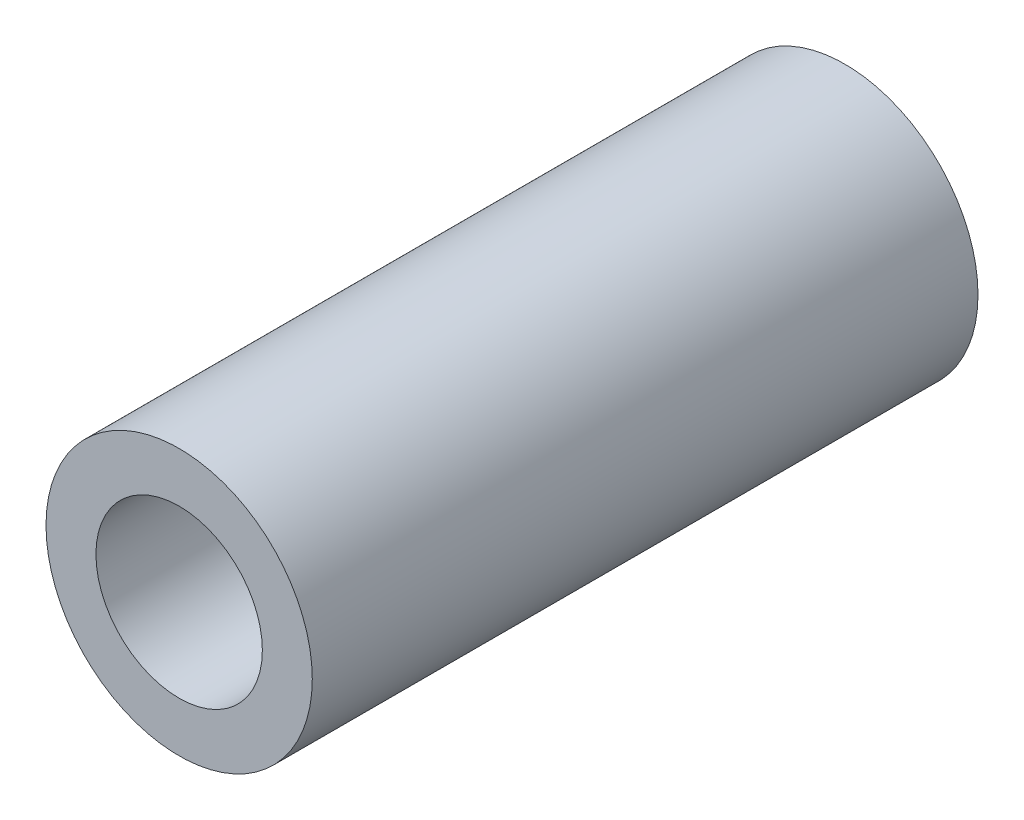
ISO-10303-21;
HEADER;
FILE_DESCRIPTION(('STEP AP214'),'2;1');
FILE_NAME('part.step','',(''),(''),'','','');
FILE_SCHEMA(('AUTOMOTIVE_DESIGN { 1 0 10303 214 1 1 1 1 }'));
ENDSEC;
DATA;
#1=APPLICATION_CONTEXT('core data for automotive mechanical design processes');
#2=APPLICATION_PROTOCOL_DEFINITION('international standard','automotive_design',2000,#1);
#3=PRODUCT_CONTEXT('',#1,'mechanical');
#4=PRODUCT('Part','Part','',(#3));
#5=PRODUCT_RELATED_PRODUCT_CATEGORY('part','',(#4));
#6=PRODUCT_DEFINITION_FORMATION('','',#4);
#7=PRODUCT_DEFINITION_CONTEXT('part definition',#1,'design');
#8=PRODUCT_DEFINITION('design','',#6,#7);
#9=PRODUCT_DEFINITION_SHAPE('','',#8);
#10=(LENGTH_UNIT() NAMED_UNIT(*) SI_UNIT(.MILLI.,.METRE.));
#11=(NAMED_UNIT(*) PLANE_ANGLE_UNIT() SI_UNIT($,.RADIAN.));
#12=(NAMED_UNIT(*) SI_UNIT($,.STERADIAN.) SOLID_ANGLE_UNIT());
#13=UNCERTAINTY_MEASURE_WITH_UNIT(LENGTH_MEASURE(1.E-05),#10,'distance_accuracy_value','');
#14=(GEOMETRIC_REPRESENTATION_CONTEXT(3) GLOBAL_UNCERTAINTY_ASSIGNED_CONTEXT((#13)) GLOBAL_UNIT_ASSIGNED_CONTEXT((#10,
#11,#12)) REPRESENTATION_CONTEXT('',''));
#15=CARTESIAN_POINT('',(0.,0.,0.));
#16=DIRECTION('',(0.,0.,1.));
#17=DIRECTION('',(1.,0.,0.));
#18=AXIS2_PLACEMENT_3D('',#15,#16,#17);
#19=CARTESIAN_POINT('',(0.,0.,10.));
#20=DIRECTION('',(0.,0.,1.));
#21=DIRECTION('',(1.,0.,0.));
#22=AXIS2_PLACEMENT_3D('',#19,#20,#21);
#23=PLANE('',#22);
#24=CARTESIAN_POINT('',(0.,0.,10.));
#25=DIRECTION('',(0.,0.,1.));
#26=DIRECTION('',(1.,0.,0.));
#27=AXIS2_PLACEMENT_3D('',#24,#25,#26);
#28=CIRCLE('',#27,4.);
#29=CARTESIAN_POINT('',(4.,0.,10.));
#30=VERTEX_POINT('',#29);
#31=EDGE_CURVE('E10',#30,#30,#28,.T.);
#32=ORIENTED_EDGE('',*,*,#31,.T.);
#33=EDGE_LOOP('',(#32));
#34=FACE_BOUND('',#33,.T.);
#35=CARTESIAN_POINT('',(0.,0.,10.));
#36=DIRECTION('',(0.,0.,1.));
#37=DIRECTION('',(1.,0.,0.));
#38=AXIS2_PLACEMENT_3D('',#35,#36,#37);
#39=CIRCLE('',#38,2.5);
#40=CARTESIAN_POINT('',(2.5,0.,10.));
#41=VERTEX_POINT('',#40);
#42=EDGE_CURVE('E56',#41,#41,#39,.T.);
#43=ORIENTED_EDGE('',*,*,#42,.F.);
#44=EDGE_LOOP('',(#43));
#45=FACE_BOUND('',#44,.T.);
#46=ADVANCED_FACE('F43',(#34,#45),#23,.T.);
#47=CARTESIAN_POINT('',(0.,0.,-10.));
#48=DIRECTION('',(0.,0.,1.));
#49=DIRECTION('',(1.,0.,0.));
#50=AXIS2_PLACEMENT_3D('',#47,#48,#49);
#51=PLANE('',#50);
#52=CARTESIAN_POINT('',(0.,0.,-10.));
#53=DIRECTION('',(0.,0.,1.));
#54=DIRECTION('',(1.,0.,0.));
#55=AXIS2_PLACEMENT_3D('',#52,#53,#54);
#56=CIRCLE('',#55,4.);
#57=CARTESIAN_POINT('',(4.,0.,-10.));
#58=VERTEX_POINT('',#57);
#59=EDGE_CURVE('E47',#58,#58,#56,.T.);
#60=ORIENTED_EDGE('',*,*,#59,.F.);
#61=EDGE_LOOP('',(#60));
#62=FACE_BOUND('',#61,.T.);
#63=CARTESIAN_POINT('',(0.,0.,-10.));
#64=DIRECTION('',(0.,0.,1.));
#65=DIRECTION('',(1.,0.,0.));
#66=AXIS2_PLACEMENT_3D('',#63,#64,#65);
#67=CIRCLE('',#66,2.5);
#68=CARTESIAN_POINT('',(2.5,0.,-10.));
#69=VERTEX_POINT('',#68);
#70=EDGE_CURVE('E58',#69,#69,#67,.T.);
#71=ORIENTED_EDGE('',*,*,#70,.T.);
#72=EDGE_LOOP('',(#71));
#73=FACE_BOUND('',#72,.T.);
#74=ADVANCED_FACE('F70',(#62,#73),#51,.F.);
#75=CARTESIAN_POINT('',(0.,0.,10.));
#76=DIRECTION('',(0.,0.,-1.));
#77=DIRECTION('',(-1.,0.,0.));
#78=AXIS2_PLACEMENT_3D('',#75,#76,#77);
#79=CYLINDRICAL_SURFACE('',#78,4.);
#80=ORIENTED_EDGE('',*,*,#31,.F.);
#81=EDGE_LOOP('',(#80));
#82=FACE_BOUND('',#81,.T.);
#83=ORIENTED_EDGE('',*,*,#59,.T.);
#84=EDGE_LOOP('',(#83));
#85=FACE_BOUND('',#84,.T.);
#86=ADVANCED_FACE('F45',(#82,#85),#79,.T.);
#87=CARTESIAN_POINT('',(0.,0.,10.));
#88=DIRECTION('',(0.,0.,-1.));
#89=DIRECTION('',(-1.,0.,0.));
#90=AXIS2_PLACEMENT_3D('',#87,#88,#89);
#91=CYLINDRICAL_SURFACE('',#90,2.5);
#92=ORIENTED_EDGE('',*,*,#42,.T.);
#93=EDGE_LOOP('',(#92));
#94=FACE_BOUND('',#93,.T.);
#95=ORIENTED_EDGE('',*,*,#70,.F.);
#96=EDGE_LOOP('',(#95));
#97=FACE_BOUND('',#96,.T.);
#98=ADVANCED_FACE('F66',(#94,#97),#91,.F.);
#99=CLOSED_SHELL('',(#46,#74,#86,#98));
#100=MANIFOLD_SOLID_BREP('B2',#99);
#101=ADVANCED_BREP_SHAPE_REPRESENTATION('',(#18,#100),#14);
#102=SHAPE_DEFINITION_REPRESENTATION(#9,#101);
ENDSEC;
END-ISO-10303-21;
